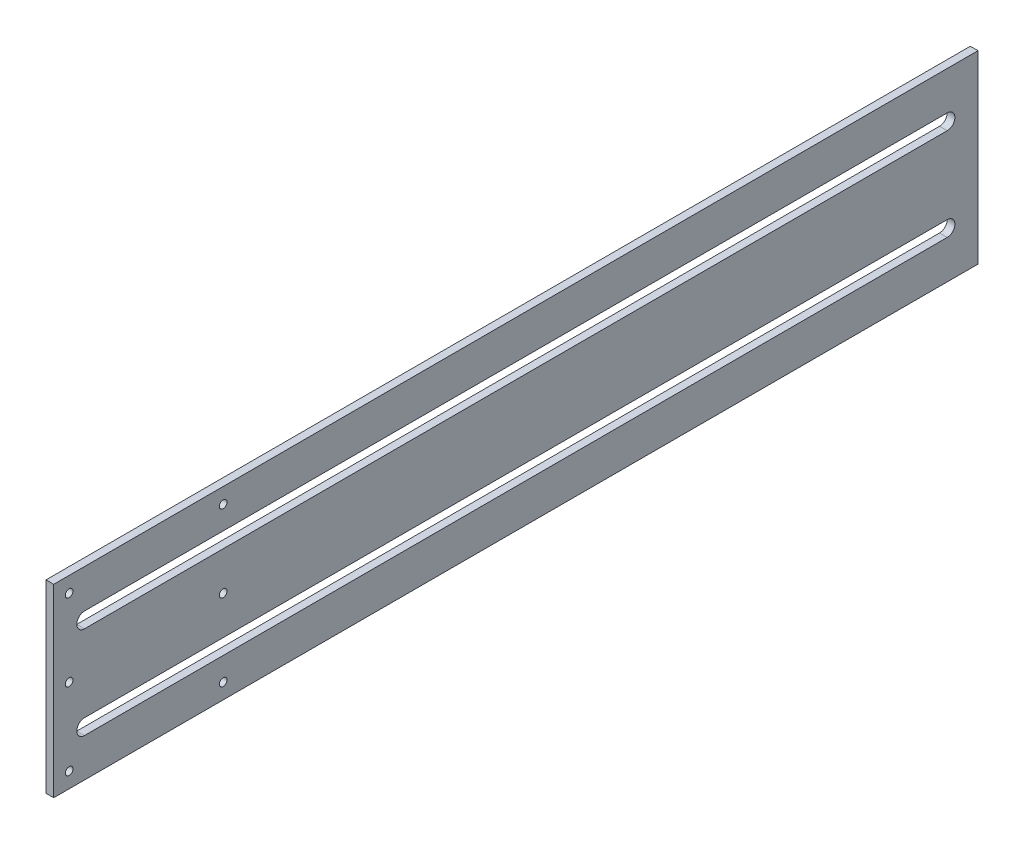
ISO-10303-21;
HEADER;
FILE_DESCRIPTION(('STEP AP214'),'2;1');
FILE_NAME('part.step','',(''),(''),'','','');
FILE_SCHEMA(('AUTOMOTIVE_DESIGN { 1 0 10303 214 1 1 1 1 }'));
ENDSEC;
DATA;
#1=APPLICATION_CONTEXT('core data for automotive mechanical design processes');
#2=APPLICATION_PROTOCOL_DEFINITION('international standard','automotive_design',2000,#1);
#3=PRODUCT_CONTEXT('',#1,'mechanical');
#4=PRODUCT('Part','Part','',(#3));
#5=PRODUCT_RELATED_PRODUCT_CATEGORY('part','',(#4));
#6=PRODUCT_DEFINITION_FORMATION('','',#4);
#7=PRODUCT_DEFINITION_CONTEXT('part definition',#1,'design');
#8=PRODUCT_DEFINITION('design','',#6,#7);
#9=PRODUCT_DEFINITION_SHAPE('','',#8);
#10=(LENGTH_UNIT() NAMED_UNIT(*) SI_UNIT(.MILLI.,.METRE.));
#11=(NAMED_UNIT(*) PLANE_ANGLE_UNIT() SI_UNIT($,.RADIAN.));
#12=(NAMED_UNIT(*) SI_UNIT($,.STERADIAN.) SOLID_ANGLE_UNIT());
#13=UNCERTAINTY_MEASURE_WITH_UNIT(LENGTH_MEASURE(1.E-05),#10,'distance_accuracy_value','');
#14=(GEOMETRIC_REPRESENTATION_CONTEXT(3) GLOBAL_UNCERTAINTY_ASSIGNED_CONTEXT((#13)) GLOBAL_UNIT_ASSIGNED_CONTEXT((#10,
#11,#12)) REPRESENTATION_CONTEXT('',''));
#15=CARTESIAN_POINT('',(0.,0.,0.));
#16=DIRECTION('',(0.,0.,1.));
#17=DIRECTION('',(1.,0.,0.));
#18=AXIS2_PLACEMENT_3D('',#15,#16,#17);
#19=CARTESIAN_POINT('',(1.5875,-38.1,-190.5));
#20=DIRECTION('',(0.,0.,1.));
#21=DIRECTION('',(1.,0.,0.));
#22=AXIS2_PLACEMENT_3D('',#19,#20,#21);
#23=PLANE('',#22);
#24=DIRECTION('',(0.,1.,0.));
#25=VECTOR('',#24,1.);
#26=CARTESIAN_POINT('',(-1.5875,-38.1,-190.5));
#27=LINE('',#26,#25);
#28=CARTESIAN_POINT('',(-1.5875,-38.1,-190.5));
#29=VERTEX_POINT('',#28);
#30=CARTESIAN_POINT('',(-1.5875,38.1,-190.5));
#31=VERTEX_POINT('',#30);
#32=EDGE_CURVE('E182',#29,#31,#27,.T.);
#33=ORIENTED_EDGE('',*,*,#32,.T.);
#34=DIRECTION('',(-1.,0.,0.));
#35=VECTOR('',#34,1.);
#36=CARTESIAN_POINT('',(1.5875,38.1,-190.5));
#37=LINE('',#36,#35);
#38=CARTESIAN_POINT('',(1.5875,38.1,-190.5));
#39=VERTEX_POINT('',#38);
#40=EDGE_CURVE('E11',#39,#31,#37,.T.);
#41=ORIENTED_EDGE('',*,*,#40,.F.);
#42=DIRECTION('',(0.,1.,0.));
#43=VECTOR('',#42,1.);
#44=CARTESIAN_POINT('',(1.5875,-38.1,-190.5));
#45=LINE('',#44,#43);
#46=CARTESIAN_POINT('',(1.5875,-38.1,-190.5));
#47=VERTEX_POINT('',#46);
#48=EDGE_CURVE('E231',#47,#39,#45,.T.);
#49=ORIENTED_EDGE('',*,*,#48,.F.);
#50=DIRECTION('',(-1.,0.,0.));
#51=VECTOR('',#50,1.);
#52=CARTESIAN_POINT('',(1.5875,-38.1,-190.5));
#53=LINE('',#52,#51);
#54=EDGE_CURVE('E245',#47,#29,#53,.T.);
#55=ORIENTED_EDGE('',*,*,#54,.T.);
#56=EDGE_LOOP('',(#33,#41,#49,#55));
#57=FACE_BOUND('',#56,.T.);
#58=ADVANCED_FACE('F44',(#57),#23,.F.);
#59=CARTESIAN_POINT('',(1.5875,38.1,190.5));
#60=DIRECTION('',(0.,-1.,0.));
#61=DIRECTION('',(0.,0.,-1.));
#62=AXIS2_PLACEMENT_3D('',#59,#60,#61);
#63=PLANE('',#62);
#64=DIRECTION('',(0.,0.,1.));
#65=VECTOR('',#64,1.);
#66=CARTESIAN_POINT('',(-1.5875,38.1,190.5));
#67=LINE('',#66,#65);
#68=CARTESIAN_POINT('',(-1.5875,38.1,190.5));
#69=VERTEX_POINT('',#68);
#70=EDGE_CURVE('E249',#31,#69,#67,.T.);
#71=ORIENTED_EDGE('',*,*,#70,.T.);
#72=DIRECTION('',(-1.,0.,0.));
#73=VECTOR('',#72,1.);
#74=CARTESIAN_POINT('',(1.5875,38.1,190.5));
#75=LINE('',#74,#73);
#76=CARTESIAN_POINT('',(1.5875,38.1,190.5));
#77=VERTEX_POINT('',#76);
#78=EDGE_CURVE('E52',#77,#69,#75,.T.);
#79=ORIENTED_EDGE('',*,*,#78,.F.);
#80=DIRECTION('',(0.,0.,1.));
#81=VECTOR('',#80,1.);
#82=CARTESIAN_POINT('',(1.5875,38.1,190.5));
#83=LINE('',#82,#81);
#84=EDGE_CURVE('E235',#39,#77,#83,.T.);
#85=ORIENTED_EDGE('',*,*,#84,.F.);
#86=ORIENTED_EDGE('',*,*,#40,.T.);
#87=EDGE_LOOP('',(#71,#79,#85,#86));
#88=FACE_BOUND('',#87,.T.);
#89=ADVANCED_FACE('F284',(#88),#63,.F.);
#90=CARTESIAN_POINT('',(1.5875,-38.1,190.5));
#91=DIRECTION('',(0.,0.,-1.));
#92=DIRECTION('',(-1.,0.,0.));
#93=AXIS2_PLACEMENT_3D('',#90,#91,#92);
#94=PLANE('',#93);
#95=DIRECTION('',(0.,-1.,0.));
#96=VECTOR('',#95,1.);
#97=CARTESIAN_POINT('',(-1.5875,-38.1,190.5));
#98=LINE('',#97,#96);
#99=CARTESIAN_POINT('',(-1.5875,-38.1,190.5));
#100=VERTEX_POINT('',#99);
#101=EDGE_CURVE('E252',#69,#100,#98,.T.);
#102=ORIENTED_EDGE('',*,*,#101,.T.);
#103=DIRECTION('',(-1.,0.,0.));
#104=VECTOR('',#103,1.);
#105=CARTESIAN_POINT('',(1.5875,-38.1,190.5));
#106=LINE('',#105,#104);
#107=CARTESIAN_POINT('',(1.5875,-38.1,190.5));
#108=VERTEX_POINT('',#107);
#109=EDGE_CURVE('E260',#108,#100,#106,.T.);
#110=ORIENTED_EDGE('',*,*,#109,.F.);
#111=DIRECTION('',(0.,-1.,0.));
#112=VECTOR('',#111,1.);
#113=CARTESIAN_POINT('',(1.5875,-38.1,190.5));
#114=LINE('',#113,#112);
#115=EDGE_CURVE('E239',#77,#108,#114,.T.);
#116=ORIENTED_EDGE('',*,*,#115,.F.);
#117=ORIENTED_EDGE('',*,*,#78,.T.);
#118=EDGE_LOOP('',(#102,#110,#116,#117));
#119=FACE_BOUND('',#118,.T.);
#120=ADVANCED_FACE('F269',(#119),#94,.F.);
#121=CARTESIAN_POINT('',(1.5875,-38.1,190.5));
#122=DIRECTION('',(0.,1.,0.));
#123=DIRECTION('',(0.,0.,1.));
#124=AXIS2_PLACEMENT_3D('',#121,#122,#123);
#125=PLANE('',#124);
#126=DIRECTION('',(0.,0.,-1.));
#127=VECTOR('',#126,1.);
#128=CARTESIAN_POINT('',(-1.5875,-38.1,190.5));
#129=LINE('',#128,#127);
#130=EDGE_CURVE('E236',#100,#29,#129,.T.);
#131=ORIENTED_EDGE('',*,*,#130,.T.);
#132=ORIENTED_EDGE('',*,*,#54,.F.);
#133=DIRECTION('',(0.,0.,-1.));
#134=VECTOR('',#133,1.);
#135=CARTESIAN_POINT('',(1.5875,-38.1,190.5));
#136=LINE('',#135,#134);
#137=EDGE_CURVE('E242',#108,#47,#136,.T.);
#138=ORIENTED_EDGE('',*,*,#137,.F.);
#139=ORIENTED_EDGE('',*,*,#109,.T.);
#140=EDGE_LOOP('',(#131,#132,#138,#139));
#141=FACE_BOUND('',#140,.T.);
#142=ADVANCED_FACE('F277',(#141),#125,.F.);
#143=CARTESIAN_POINT('',(1.5875,0.,0.));
#144=DIRECTION('',(-1.,0.,0.));
#145=DIRECTION('',(0.,0.,1.));
#146=AXIS2_PLACEMENT_3D('',#143,#144,#145);
#147=PLANE('',#146);
#148=CARTESIAN_POINT('',(1.5875,31.75,120.65));
#149=DIRECTION('',(1.,0.,0.));
#150=DIRECTION('',(0.,0.,-1.));
#151=AXIS2_PLACEMENT_3D('',#148,#149,#150);
#152=CIRCLE('',#151,1.58749999999999);
#153=CARTESIAN_POINT('',(1.5875,31.75,119.0625));
#154=VERTEX_POINT('',#153);
#155=EDGE_CURVE('E370',#154,#154,#152,.T.);
#156=ORIENTED_EDGE('',*,*,#155,.F.);
#157=EDGE_LOOP('',(#156));
#158=FACE_BOUND('',#157,.T.);
#159=CARTESIAN_POINT('',(1.5875,0.,120.65));
#160=DIRECTION('',(1.,0.,0.));
#161=DIRECTION('',(0.,0.,-1.));
#162=AXIS2_PLACEMENT_3D('',#159,#160,#161);
#163=CIRCLE('',#162,1.5875);
#164=CARTESIAN_POINT('',(1.5875,0.,119.0625));
#165=VERTEX_POINT('',#164);
#166=EDGE_CURVE('E378',#165,#165,#163,.T.);
#167=ORIENTED_EDGE('',*,*,#166,.F.);
#168=EDGE_LOOP('',(#167));
#169=FACE_BOUND('',#168,.T.);
#170=CARTESIAN_POINT('',(1.5875,-31.75,120.65));
#171=DIRECTION('',(1.,0.,0.));
#172=DIRECTION('',(0.,0.,1.));
#173=AXIS2_PLACEMENT_3D('',#170,#171,#172);
#174=CIRCLE('',#173,1.58749999999999);
#175=CARTESIAN_POINT('',(1.5875,-31.75,122.2375));
#176=VERTEX_POINT('',#175);
#177=EDGE_CURVE('E386',#176,#176,#174,.T.);
#178=ORIENTED_EDGE('',*,*,#177,.F.);
#179=EDGE_LOOP('',(#178));
#180=FACE_BOUND('',#179,.T.);
#181=CARTESIAN_POINT('',(1.5875,-31.75,184.15));
#182=DIRECTION('',(1.,0.,0.));
#183=DIRECTION('',(0.,0.,1.));
#184=AXIS2_PLACEMENT_3D('',#181,#182,#183);
#185=CIRCLE('',#184,1.58749999999999);
#186=CARTESIAN_POINT('',(1.5875,-31.75,185.7375));
#187=VERTEX_POINT('',#186);
#188=EDGE_CURVE('E366',#187,#187,#185,.T.);
#189=ORIENTED_EDGE('',*,*,#188,.F.);
#190=EDGE_LOOP('',(#189));
#191=FACE_BOUND('',#190,.T.);
#192=CARTESIAN_POINT('',(1.5875,0.,184.15));
#193=DIRECTION('',(1.,0.,0.));
#194=DIRECTION('',(0.,0.,-1.));
#195=AXIS2_PLACEMENT_3D('',#192,#193,#194);
#196=CIRCLE('',#195,1.58749999999999);
#197=CARTESIAN_POINT('',(1.5875,0.,182.5625));
#198=VERTEX_POINT('',#197);
#199=EDGE_CURVE('E358',#198,#198,#196,.T.);
#200=ORIENTED_EDGE('',*,*,#199,.F.);
#201=EDGE_LOOP('',(#200));
#202=FACE_BOUND('',#201,.T.);
#203=CARTESIAN_POINT('',(1.5875,31.75,184.15));
#204=DIRECTION('',(1.,0.,0.));
#205=DIRECTION('',(0.,0.,-1.));
#206=AXIS2_PLACEMENT_3D('',#203,#204,#205);
#207=CIRCLE('',#206,1.58749999999999);
#208=CARTESIAN_POINT('',(1.5875,31.75,182.5625));
#209=VERTEX_POINT('',#208);
#210=EDGE_CURVE('E164',#209,#209,#207,.T.);
#211=ORIENTED_EDGE('',*,*,#210,.F.);
#212=EDGE_LOOP('',(#211));
#213=FACE_BOUND('',#212,.T.);
#214=DIRECTION('',(0.,0.,-1.));
#215=VECTOR('',#214,1.);
#216=CARTESIAN_POINT('',(1.5875,15.875,177.8));
#217=LINE('',#216,#215);
#218=CARTESIAN_POINT('',(1.5875,15.875,177.8));
#219=VERTEX_POINT('',#218);
#220=CARTESIAN_POINT('',(1.5875,15.875,-177.8));
#221=VERTEX_POINT('',#220);
#222=EDGE_CURVE('E173',#219,#221,#217,.T.);
#223=ORIENTED_EDGE('',*,*,#222,.F.);
#224=CARTESIAN_POINT('',(1.5875,19.05,177.8));
#225=DIRECTION('',(1.,0.,0.));
#226=DIRECTION('',(0.,0.,-1.));
#227=AXIS2_PLACEMENT_3D('',#224,#225,#226);
#228=CIRCLE('',#227,3.175);
#229=CARTESIAN_POINT('',(1.5875,22.225,177.8));
#230=VERTEX_POINT('',#229);
#231=EDGE_CURVE('E59',#230,#219,#228,.T.);
#232=ORIENTED_EDGE('',*,*,#231,.F.);
#233=DIRECTION('',(0.,0.,1.));
#234=VECTOR('',#233,1.);
#235=CARTESIAN_POINT('',(1.5875,22.225,177.8));
#236=LINE('',#235,#234);
#237=CARTESIAN_POINT('',(1.5875,22.225,-177.8));
#238=VERTEX_POINT('',#237);
#239=EDGE_CURVE('E157',#238,#230,#236,.T.);
#240=ORIENTED_EDGE('',*,*,#239,.F.);
#241=CARTESIAN_POINT('',(1.5875,19.05,-177.8));
#242=DIRECTION('',(1.,0.,0.));
#243=DIRECTION('',(0.,0.,-1.));
#244=AXIS2_PLACEMENT_3D('',#241,#242,#243);
#245=CIRCLE('',#244,3.175);
#246=EDGE_CURVE('E161',#221,#238,#245,.T.);
#247=ORIENTED_EDGE('',*,*,#246,.F.);
#248=EDGE_LOOP('',(#223,#232,#240,#247));
#249=FACE_BOUND('',#248,.T.);
#250=DIRECTION('',(0.,0.,-1.));
#251=VECTOR('',#250,1.);
#252=CARTESIAN_POINT('',(1.5875,-22.225,177.8));
#253=LINE('',#252,#251);
#254=CARTESIAN_POINT('',(1.5875,-22.225,177.8));
#255=VERTEX_POINT('',#254);
#256=CARTESIAN_POINT('',(1.5875,-22.225,-177.8));
#257=VERTEX_POINT('',#256);
#258=EDGE_CURVE('E211',#255,#257,#253,.T.);
#259=ORIENTED_EDGE('',*,*,#258,.F.);
#260=CARTESIAN_POINT('',(1.5875,-19.05,177.8));
#261=DIRECTION('',(1.,0.,0.));
#262=DIRECTION('',(0.,0.,1.));
#263=AXIS2_PLACEMENT_3D('',#260,#261,#262);
#264=CIRCLE('',#263,3.175);
#265=CARTESIAN_POINT('',(1.5875,-15.875,177.8));
#266=VERTEX_POINT('',#265);
#267=EDGE_CURVE('E67',#266,#255,#264,.T.);
#268=ORIENTED_EDGE('',*,*,#267,.F.);
#269=DIRECTION('',(0.,0.,1.));
#270=VECTOR('',#269,1.);
#271=CARTESIAN_POINT('',(1.5875,-15.875,177.8));
#272=LINE('',#271,#270);
#273=CARTESIAN_POINT('',(1.5875,-15.875,-177.8));
#274=VERTEX_POINT('',#273);
#275=EDGE_CURVE('E202',#274,#266,#272,.T.);
#276=ORIENTED_EDGE('',*,*,#275,.F.);
#277=CARTESIAN_POINT('',(1.5875,-19.05,-177.8));
#278=DIRECTION('',(1.,0.,0.));
#279=DIRECTION('',(0.,0.,1.));
#280=AXIS2_PLACEMENT_3D('',#277,#278,#279);
#281=CIRCLE('',#280,3.175);
#282=EDGE_CURVE('E206',#257,#274,#281,.T.);
#283=ORIENTED_EDGE('',*,*,#282,.F.);
#284=EDGE_LOOP('',(#259,#268,#276,#283));
#285=FACE_BOUND('',#284,.T.);
#286=ORIENTED_EDGE('',*,*,#48,.T.);
#287=ORIENTED_EDGE('',*,*,#84,.T.);
#288=ORIENTED_EDGE('',*,*,#115,.T.);
#289=ORIENTED_EDGE('',*,*,#137,.T.);
#290=EDGE_LOOP('',(#286,#287,#288,#289));
#291=FACE_BOUND('',#290,.T.);
#292=ADVANCED_FACE('F283',(#158,#169,#180,#191,#202,#213,#249,#285,#291),#147,.F.);
#293=CARTESIAN_POINT('',(-1.5875,0.,0.));
#294=DIRECTION('',(-1.,0.,0.));
#295=DIRECTION('',(0.,0.,1.));
#296=AXIS2_PLACEMENT_3D('',#293,#294,#295);
#297=PLANE('',#296);
#298=CARTESIAN_POINT('',(-1.5875,31.75,120.65));
#299=DIRECTION('',(1.,0.,0.));
#300=DIRECTION('',(0.,0.,-1.));
#301=AXIS2_PLACEMENT_3D('',#298,#299,#300);
#302=CIRCLE('',#301,1.58749999999999);
#303=CARTESIAN_POINT('',(-1.5875,31.75,119.0625));
#304=VERTEX_POINT('',#303);
#305=EDGE_CURVE('E374',#304,#304,#302,.T.);
#306=ORIENTED_EDGE('',*,*,#305,.T.);
#307=EDGE_LOOP('',(#306));
#308=FACE_BOUND('',#307,.T.);
#309=CARTESIAN_POINT('',(-1.5875,0.,120.65));
#310=DIRECTION('',(1.,0.,0.));
#311=DIRECTION('',(0.,0.,-1.));
#312=AXIS2_PLACEMENT_3D('',#309,#310,#311);
#313=CIRCLE('',#312,1.5875);
#314=CARTESIAN_POINT('',(-1.5875,0.,119.0625));
#315=VERTEX_POINT('',#314);
#316=EDGE_CURVE('E382',#315,#315,#313,.T.);
#317=ORIENTED_EDGE('',*,*,#316,.T.);
#318=EDGE_LOOP('',(#317));
#319=FACE_BOUND('',#318,.T.);
#320=CARTESIAN_POINT('',(-1.5875,-31.75,120.65));
#321=DIRECTION('',(1.,0.,0.));
#322=DIRECTION('',(0.,0.,1.));
#323=AXIS2_PLACEMENT_3D('',#320,#321,#322);
#324=CIRCLE('',#323,1.58749999999999);
#325=CARTESIAN_POINT('',(-1.5875,-31.75,122.2375));
#326=VERTEX_POINT('',#325);
#327=EDGE_CURVE('E390',#326,#326,#324,.T.);
#328=ORIENTED_EDGE('',*,*,#327,.T.);
#329=EDGE_LOOP('',(#328));
#330=FACE_BOUND('',#329,.T.);
#331=CARTESIAN_POINT('',(-1.5875,-31.75,184.15));
#332=DIRECTION('',(1.,0.,0.));
#333=DIRECTION('',(0.,0.,1.));
#334=AXIS2_PLACEMENT_3D('',#331,#332,#333);
#335=CIRCLE('',#334,1.58749999999999);
#336=CARTESIAN_POINT('',(-1.5875,-31.75,185.7375));
#337=VERTEX_POINT('',#336);
#338=EDGE_CURVE('E361',#337,#337,#335,.T.);
#339=ORIENTED_EDGE('',*,*,#338,.T.);
#340=EDGE_LOOP('',(#339));
#341=FACE_BOUND('',#340,.T.);
#342=CARTESIAN_POINT('',(-1.5875,0.,184.15));
#343=DIRECTION('',(1.,0.,0.));
#344=DIRECTION('',(0.,0.,-1.));
#345=AXIS2_PLACEMENT_3D('',#342,#343,#344);
#346=CIRCLE('',#345,1.58749999999999);
#347=CARTESIAN_POINT('',(-1.5875,0.,182.5625));
#348=VERTEX_POINT('',#347);
#349=EDGE_CURVE('E355',#348,#348,#346,.T.);
#350=ORIENTED_EDGE('',*,*,#349,.T.);
#351=EDGE_LOOP('',(#350));
#352=FACE_BOUND('',#351,.T.);
#353=CARTESIAN_POINT('',(-1.5875,31.75,184.15));
#354=DIRECTION('',(1.,0.,0.));
#355=DIRECTION('',(0.,0.,-1.));
#356=AXIS2_PLACEMENT_3D('',#353,#354,#355);
#357=CIRCLE('',#356,1.58749999999999);
#358=CARTESIAN_POINT('',(-1.5875,31.75,182.5625));
#359=VERTEX_POINT('',#358);
#360=EDGE_CURVE('E201',#359,#359,#357,.T.);
#361=ORIENTED_EDGE('',*,*,#360,.T.);
#362=EDGE_LOOP('',(#361));
#363=FACE_BOUND('',#362,.T.);
#364=CARTESIAN_POINT('',(-1.5875,19.05,177.8));
#365=DIRECTION('',(1.,0.,0.));
#366=DIRECTION('',(0.,0.,-1.));
#367=AXIS2_PLACEMENT_3D('',#364,#365,#366);
#368=CIRCLE('',#367,3.175);
#369=CARTESIAN_POINT('',(-1.5875,22.225,177.8));
#370=VERTEX_POINT('',#369);
#371=CARTESIAN_POINT('',(-1.5875,15.875,177.8));
#372=VERTEX_POINT('',#371);
#373=EDGE_CURVE('E135',#370,#372,#368,.T.);
#374=ORIENTED_EDGE('',*,*,#373,.T.);
#375=DIRECTION('',(0.,0.,-1.));
#376=VECTOR('',#375,1.);
#377=CARTESIAN_POINT('',(-1.5875,15.875,177.8));
#378=LINE('',#377,#376);
#379=CARTESIAN_POINT('',(-1.5875,15.875,-177.8));
#380=VERTEX_POINT('',#379);
#381=EDGE_CURVE('E146',#372,#380,#378,.T.);
#382=ORIENTED_EDGE('',*,*,#381,.T.);
#383=CARTESIAN_POINT('',(-1.5875,19.05,-177.8));
#384=DIRECTION('',(1.,0.,0.));
#385=DIRECTION('',(0.,0.,-1.));
#386=AXIS2_PLACEMENT_3D('',#383,#384,#385);
#387=CIRCLE('',#386,3.175);
#388=CARTESIAN_POINT('',(-1.5875,22.225,-177.8));
#389=VERTEX_POINT('',#388);
#390=EDGE_CURVE('E151',#380,#389,#387,.T.);
#391=ORIENTED_EDGE('',*,*,#390,.T.);
#392=DIRECTION('',(0.,0.,1.));
#393=VECTOR('',#392,1.);
#394=CARTESIAN_POINT('',(-1.5875,22.225,177.8));
#395=LINE('',#394,#393);
#396=EDGE_CURVE('E142',#389,#370,#395,.T.);
#397=ORIENTED_EDGE('',*,*,#396,.T.);
#398=EDGE_LOOP('',(#374,#382,#391,#397));
#399=FACE_BOUND('',#398,.T.);
#400=CARTESIAN_POINT('',(-1.5875,-19.05,177.8));
#401=DIRECTION('',(1.,0.,0.));
#402=DIRECTION('',(0.,0.,1.));
#403=AXIS2_PLACEMENT_3D('',#400,#401,#402);
#404=CIRCLE('',#403,3.175);
#405=CARTESIAN_POINT('',(-1.5875,-15.875,177.8));
#406=VERTEX_POINT('',#405);
#407=CARTESIAN_POINT('',(-1.5875,-22.225,177.8));
#408=VERTEX_POINT('',#407);
#409=EDGE_CURVE('E207',#406,#408,#404,.T.);
#410=ORIENTED_EDGE('',*,*,#409,.T.);
#411=DIRECTION('',(0.,0.,-1.));
#412=VECTOR('',#411,1.);
#413=CARTESIAN_POINT('',(-1.5875,-22.225,177.8));
#414=LINE('',#413,#412);
#415=CARTESIAN_POINT('',(-1.5875,-22.225,-177.8));
#416=VERTEX_POINT('',#415);
#417=EDGE_CURVE('E224',#408,#416,#414,.T.);
#418=ORIENTED_EDGE('',*,*,#417,.T.);
#419=CARTESIAN_POINT('',(-1.5875,-19.05,-177.8));
#420=DIRECTION('',(1.,0.,0.));
#421=DIRECTION('',(0.,0.,1.));
#422=AXIS2_PLACEMENT_3D('',#419,#420,#421);
#423=CIRCLE('',#422,3.175);
#424=CARTESIAN_POINT('',(-1.5875,-15.875,-177.8));
#425=VERTEX_POINT('',#424);
#426=EDGE_CURVE('E220',#416,#425,#423,.T.);
#427=ORIENTED_EDGE('',*,*,#426,.T.);
#428=DIRECTION('',(0.,0.,1.));
#429=VECTOR('',#428,1.);
#430=CARTESIAN_POINT('',(-1.5875,-15.875,177.8));
#431=LINE('',#430,#429);
#432=EDGE_CURVE('E191',#425,#406,#431,.T.);
#433=ORIENTED_EDGE('',*,*,#432,.T.);
#434=EDGE_LOOP('',(#410,#418,#427,#433));
#435=FACE_BOUND('',#434,.T.);
#436=ORIENTED_EDGE('',*,*,#32,.F.);
#437=ORIENTED_EDGE('',*,*,#130,.F.);
#438=ORIENTED_EDGE('',*,*,#101,.F.);
#439=ORIENTED_EDGE('',*,*,#70,.F.);
#440=EDGE_LOOP('',(#436,#437,#438,#439));
#441=FACE_BOUND('',#440,.T.);
#442=ADVANCED_FACE('F153',(#308,#319,#330,#341,#352,#363,#399,#435,#441),#297,.T.);
#443=CARTESIAN_POINT('',(-1.5875,-19.05,177.8));
#444=DIRECTION('',(1.,0.,0.));
#445=DIRECTION('',(0.,0.,-1.));
#446=AXIS2_PLACEMENT_3D('',#443,#444,#445);
#447=CYLINDRICAL_SURFACE('',#446,3.175);
#448=ORIENTED_EDGE('',*,*,#267,.T.);
#449=DIRECTION('',(1.,0.,0.));
#450=VECTOR('',#449,1.);
#451=CARTESIAN_POINT('',(-1.5875,-22.225,177.8));
#452=LINE('',#451,#450);
#453=EDGE_CURVE('E188',#408,#255,#452,.T.);
#454=ORIENTED_EDGE('',*,*,#453,.F.);
#455=ORIENTED_EDGE('',*,*,#409,.F.);
#456=DIRECTION('',(1.,0.,0.));
#457=VECTOR('',#456,1.);
#458=CARTESIAN_POINT('',(-1.5875,-15.875,177.8));
#459=LINE('',#458,#457);
#460=EDGE_CURVE('E198',#406,#266,#459,.T.);
#461=ORIENTED_EDGE('',*,*,#460,.T.);
#462=EDGE_LOOP('',(#448,#454,#455,#461));
#463=FACE_BOUND('',#462,.T.);
#464=ADVANCED_FACE('F296',(#463),#447,.F.);
#465=CARTESIAN_POINT('',(-1.5875,-15.875,177.8));
#466=DIRECTION('',(0.,1.,0.));
#467=DIRECTION('',(0.,0.,1.));
#468=AXIS2_PLACEMENT_3D('',#465,#466,#467);
#469=PLANE('',#468);
#470=ORIENTED_EDGE('',*,*,#275,.T.);
#471=ORIENTED_EDGE('',*,*,#460,.F.);
#472=ORIENTED_EDGE('',*,*,#432,.F.);
#473=DIRECTION('',(1.,0.,0.));
#474=VECTOR('',#473,1.);
#475=CARTESIAN_POINT('',(-1.5875,-15.875,-177.8));
#476=LINE('',#475,#474);
#477=EDGE_CURVE('E195',#425,#274,#476,.T.);
#478=ORIENTED_EDGE('',*,*,#477,.T.);
#479=EDGE_LOOP('',(#470,#471,#472,#478));
#480=FACE_BOUND('',#479,.T.);
#481=ADVANCED_FACE('F301',(#480),#469,.F.);
#482=CARTESIAN_POINT('',(-1.5875,-19.05,-177.8));
#483=DIRECTION('',(1.,0.,0.));
#484=DIRECTION('',(0.,0.,-1.));
#485=AXIS2_PLACEMENT_3D('',#482,#483,#484);
#486=CYLINDRICAL_SURFACE('',#485,3.175);
#487=ORIENTED_EDGE('',*,*,#282,.T.);
#488=ORIENTED_EDGE('',*,*,#477,.F.);
#489=ORIENTED_EDGE('',*,*,#426,.F.);
#490=DIRECTION('',(1.,0.,0.));
#491=VECTOR('',#490,1.);
#492=CARTESIAN_POINT('',(-1.5875,-22.225,-177.8));
#493=LINE('',#492,#491);
#494=EDGE_CURVE('E192',#416,#257,#493,.T.);
#495=ORIENTED_EDGE('',*,*,#494,.T.);
#496=EDGE_LOOP('',(#487,#488,#489,#495));
#497=FACE_BOUND('',#496,.T.);
#498=ADVANCED_FACE('F304',(#497),#486,.F.);
#499=CARTESIAN_POINT('',(-1.5875,-22.225,177.8));
#500=DIRECTION('',(0.,-1.,0.));
#501=DIRECTION('',(0.,0.,-1.));
#502=AXIS2_PLACEMENT_3D('',#499,#500,#501);
#503=PLANE('',#502);
#504=ORIENTED_EDGE('',*,*,#258,.T.);
#505=ORIENTED_EDGE('',*,*,#494,.F.);
#506=ORIENTED_EDGE('',*,*,#417,.F.);
#507=ORIENTED_EDGE('',*,*,#453,.T.);
#508=EDGE_LOOP('',(#504,#505,#506,#507));
#509=FACE_BOUND('',#508,.T.);
#510=ADVANCED_FACE('F308',(#509),#503,.F.);
#511=CARTESIAN_POINT('',(-1.5875,19.05,177.8));
#512=DIRECTION('',(1.,0.,0.));
#513=DIRECTION('',(0.,0.,-1.));
#514=AXIS2_PLACEMENT_3D('',#511,#512,#513);
#515=CYLINDRICAL_SURFACE('',#514,3.175);
#516=ORIENTED_EDGE('',*,*,#231,.T.);
#517=DIRECTION('',(1.,0.,0.));
#518=VECTOR('',#517,1.);
#519=CARTESIAN_POINT('',(-1.5875,15.875,177.8));
#520=LINE('',#519,#518);
#521=EDGE_CURVE('E131',#372,#219,#520,.T.);
#522=ORIENTED_EDGE('',*,*,#521,.F.);
#523=ORIENTED_EDGE('',*,*,#373,.F.);
#524=DIRECTION('',(1.,0.,0.));
#525=VECTOR('',#524,1.);
#526=CARTESIAN_POINT('',(-1.5875,22.225,177.8));
#527=LINE('',#526,#525);
#528=EDGE_CURVE('E179',#370,#230,#527,.T.);
#529=ORIENTED_EDGE('',*,*,#528,.T.);
#530=EDGE_LOOP('',(#516,#522,#523,#529));
#531=FACE_BOUND('',#530,.T.);
#532=ADVANCED_FACE('F133',(#531),#515,.F.);
#533=CARTESIAN_POINT('',(-1.5875,22.225,177.8));
#534=DIRECTION('',(0.,1.,0.));
#535=DIRECTION('',(0.,0.,1.));
#536=AXIS2_PLACEMENT_3D('',#533,#534,#535);
#537=PLANE('',#536);
#538=ORIENTED_EDGE('',*,*,#239,.T.);
#539=ORIENTED_EDGE('',*,*,#528,.F.);
#540=ORIENTED_EDGE('',*,*,#396,.F.);
#541=DIRECTION('',(1.,0.,0.));
#542=VECTOR('',#541,1.);
#543=CARTESIAN_POINT('',(-1.5875,22.225,-177.8));
#544=LINE('',#543,#542);
#545=EDGE_CURVE('E183',#389,#238,#544,.T.);
#546=ORIENTED_EDGE('',*,*,#545,.T.);
#547=EDGE_LOOP('',(#538,#539,#540,#546));
#548=FACE_BOUND('',#547,.T.);
#549=ADVANCED_FACE('F317',(#548),#537,.F.);
#550=CARTESIAN_POINT('',(-1.5875,19.05,-177.8));
#551=DIRECTION('',(1.,0.,0.));
#552=DIRECTION('',(0.,0.,-1.));
#553=AXIS2_PLACEMENT_3D('',#550,#551,#552);
#554=CYLINDRICAL_SURFACE('',#553,3.175);
#555=ORIENTED_EDGE('',*,*,#246,.T.);
#556=ORIENTED_EDGE('',*,*,#545,.F.);
#557=ORIENTED_EDGE('',*,*,#390,.F.);
#558=DIRECTION('',(1.,0.,0.));
#559=VECTOR('',#558,1.);
#560=CARTESIAN_POINT('',(-1.5875,15.875,-177.8));
#561=LINE('',#560,#559);
#562=EDGE_CURVE('E141',#380,#221,#561,.T.);
#563=ORIENTED_EDGE('',*,*,#562,.T.);
#564=EDGE_LOOP('',(#555,#556,#557,#563));
#565=FACE_BOUND('',#564,.T.);
#566=ADVANCED_FACE('F321',(#565),#554,.F.);
#567=CARTESIAN_POINT('',(-1.5875,15.875,177.8));
#568=DIRECTION('',(0.,-1.,0.));
#569=DIRECTION('',(0.,0.,-1.));
#570=AXIS2_PLACEMENT_3D('',#567,#568,#569);
#571=PLANE('',#570);
#572=ORIENTED_EDGE('',*,*,#222,.T.);
#573=ORIENTED_EDGE('',*,*,#562,.F.);
#574=ORIENTED_EDGE('',*,*,#381,.F.);
#575=ORIENTED_EDGE('',*,*,#521,.T.);
#576=EDGE_LOOP('',(#572,#573,#574,#575));
#577=FACE_BOUND('',#576,.T.);
#578=ADVANCED_FACE('F147',(#577),#571,.F.);
#579=CARTESIAN_POINT('',(-1.5875,31.75,184.15));
#580=DIRECTION('',(1.,0.,0.));
#581=DIRECTION('',(0.,0.,-1.));
#582=AXIS2_PLACEMENT_3D('',#579,#580,#581);
#583=CYLINDRICAL_SURFACE('',#582,1.58749999999999);
#584=ORIENTED_EDGE('',*,*,#360,.F.);
#585=EDGE_LOOP('',(#584));
#586=FACE_BOUND('',#585,.T.);
#587=ORIENTED_EDGE('',*,*,#210,.T.);
#588=EDGE_LOOP('',(#587));
#589=FACE_BOUND('',#588,.T.);
#590=ADVANCED_FACE('F320',(#586,#589),#583,.F.);
#591=CARTESIAN_POINT('',(-1.5875,0.,184.15));
#592=DIRECTION('',(1.,0.,0.));
#593=DIRECTION('',(0.,0.,-1.));
#594=AXIS2_PLACEMENT_3D('',#591,#592,#593);
#595=CYLINDRICAL_SURFACE('',#594,1.58749999999999);
#596=ORIENTED_EDGE('',*,*,#349,.F.);
#597=EDGE_LOOP('',(#596));
#598=FACE_BOUND('',#597,.T.);
#599=ORIENTED_EDGE('',*,*,#199,.T.);
#600=EDGE_LOOP('',(#599));
#601=FACE_BOUND('',#600,.T.);
#602=ADVANCED_FACE('F330',(#598,#601),#595,.F.);
#603=CARTESIAN_POINT('',(-1.5875,-31.75,184.15));
#604=DIRECTION('',(1.,0.,0.));
#605=DIRECTION('',(0.,0.,-1.));
#606=AXIS2_PLACEMENT_3D('',#603,#604,#605);
#607=CYLINDRICAL_SURFACE('',#606,1.58749999999999);
#608=ORIENTED_EDGE('',*,*,#338,.F.);
#609=EDGE_LOOP('',(#608));
#610=FACE_BOUND('',#609,.T.);
#611=ORIENTED_EDGE('',*,*,#188,.T.);
#612=EDGE_LOOP('',(#611));
#613=FACE_BOUND('',#612,.T.);
#614=ADVANCED_FACE('F332',(#610,#613),#607,.F.);
#615=CARTESIAN_POINT('',(-1.5875,-31.75,120.65));
#616=DIRECTION('',(1.,0.,0.));
#617=DIRECTION('',(0.,0.,-1.));
#618=AXIS2_PLACEMENT_3D('',#615,#616,#617);
#619=CYLINDRICAL_SURFACE('',#618,1.58749999999999);
#620=ORIENTED_EDGE('',*,*,#327,.F.);
#621=EDGE_LOOP('',(#620));
#622=FACE_BOUND('',#621,.T.);
#623=ORIENTED_EDGE('',*,*,#177,.T.);
#624=EDGE_LOOP('',(#623));
#625=FACE_BOUND('',#624,.T.);
#626=ADVANCED_FACE('F335',(#622,#625),#619,.F.);
#627=CARTESIAN_POINT('',(-1.5875,0.,120.65));
#628=DIRECTION('',(1.,0.,0.));
#629=DIRECTION('',(0.,0.,-1.));
#630=AXIS2_PLACEMENT_3D('',#627,#628,#629);
#631=CYLINDRICAL_SURFACE('',#630,1.5875);
#632=ORIENTED_EDGE('',*,*,#316,.F.);
#633=EDGE_LOOP('',(#632));
#634=FACE_BOUND('',#633,.T.);
#635=ORIENTED_EDGE('',*,*,#166,.T.);
#636=EDGE_LOOP('',(#635));
#637=FACE_BOUND('',#636,.T.);
#638=ADVANCED_FACE('F339',(#634,#637),#631,.F.);
#639=CARTESIAN_POINT('',(-1.5875,31.75,120.65));
#640=DIRECTION('',(1.,0.,0.));
#641=DIRECTION('',(0.,0.,-1.));
#642=AXIS2_PLACEMENT_3D('',#639,#640,#641);
#643=CYLINDRICAL_SURFACE('',#642,1.58749999999999);
#644=ORIENTED_EDGE('',*,*,#305,.F.);
#645=EDGE_LOOP('',(#644));
#646=FACE_BOUND('',#645,.T.);
#647=ORIENTED_EDGE('',*,*,#155,.T.);
#648=EDGE_LOOP('',(#647));
#649=FACE_BOUND('',#648,.T.);
#650=ADVANCED_FACE('F343',(#646,#649),#643,.F.);
#651=CLOSED_SHELL('',(#58,#89,#120,#142,#292,#442,#464,#481,#498,#510,#532,#549,#566,#578,#590,
#602,#614,#626,#638,#650));
#652=MANIFOLD_SOLID_BREP('B2',#651);
#653=ADVANCED_BREP_SHAPE_REPRESENTATION('',(#18,#652),#14);
#654=SHAPE_DEFINITION_REPRESENTATION(#9,#653);
ENDSEC;
END-ISO-10303-21;
